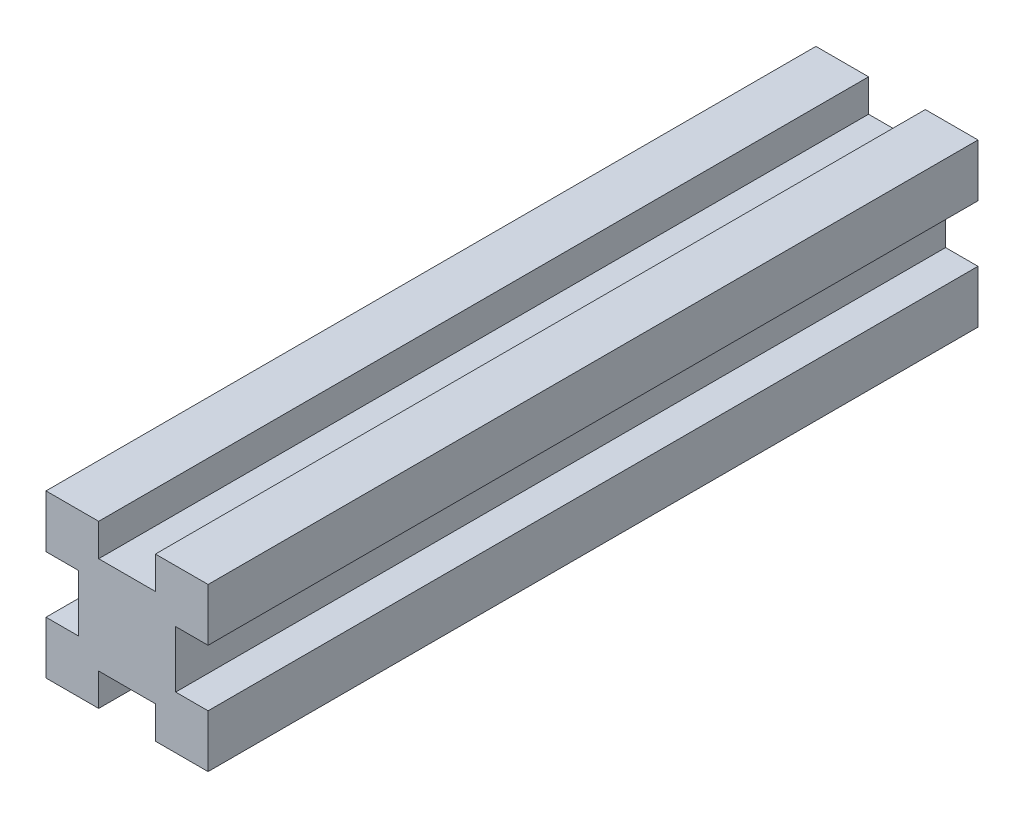
ISO-10303-21;
HEADER;
FILE_DESCRIPTION(('STEP AP214'),'2;1');
FILE_NAME('part.step','',(''),(''),'','','');
FILE_SCHEMA(('AUTOMOTIVE_DESIGN { 1 0 10303 214 1 1 1 1 }'));
ENDSEC;
DATA;
#1=APPLICATION_CONTEXT('core data for automotive mechanical design processes');
#2=APPLICATION_PROTOCOL_DEFINITION('international standard','automotive_design',2000,#1);
#3=PRODUCT_CONTEXT('',#1,'mechanical');
#4=PRODUCT('Part','Part','',(#3));
#5=PRODUCT_RELATED_PRODUCT_CATEGORY('part','',(#4));
#6=PRODUCT_DEFINITION_FORMATION('','',#4);
#7=PRODUCT_DEFINITION_CONTEXT('part definition',#1,'design');
#8=PRODUCT_DEFINITION('design','',#6,#7);
#9=PRODUCT_DEFINITION_SHAPE('','',#8);
#10=(LENGTH_UNIT() NAMED_UNIT(*) SI_UNIT(.MILLI.,.METRE.));
#11=(NAMED_UNIT(*) PLANE_ANGLE_UNIT() SI_UNIT($,.RADIAN.));
#12=(NAMED_UNIT(*) SI_UNIT($,.STERADIAN.) SOLID_ANGLE_UNIT());
#13=UNCERTAINTY_MEASURE_WITH_UNIT(LENGTH_MEASURE(1.E-05),#10,'distance_accuracy_value','');
#14=(GEOMETRIC_REPRESENTATION_CONTEXT(3) GLOBAL_UNCERTAINTY_ASSIGNED_CONTEXT((#13)) GLOBAL_UNIT_ASSIGNED_CONTEXT((#10,
#11,#12)) REPRESENTATION_CONTEXT('',''));
#15=CARTESIAN_POINT('',(0.,0.,0.));
#16=DIRECTION('',(0.,0.,1.));
#17=DIRECTION('',(1.,0.,0.));
#18=AXIS2_PLACEMENT_3D('',#15,#16,#17);
#19=CARTESIAN_POINT('',(0.,0.,0.));
#20=DIRECTION('',(0.,0.,1.));
#21=DIRECTION('',(1.,0.,0.));
#22=AXIS2_PLACEMENT_3D('',#19,#20,#21);
#23=PLANE('',#22);
#24=DIRECTION('',(1.,0.,0.));
#25=VECTOR('',#24,1.);
#26=CARTESIAN_POINT('',(0.,-3.50000000000081,0.));
#27=LINE('',#26,#25);
#28=CARTESIAN_POINT('',(-10.,-3.50000000000081,0.));
#29=VERTEX_POINT('',#28);
#30=CARTESIAN_POINT('',(-5.99999999999979,-3.50000000000081,0.));
#31=VERTEX_POINT('',#30);
#32=EDGE_CURVE('E286',#29,#31,#27,.T.);
#33=ORIENTED_EDGE('',*,*,#32,.T.);
#34=DIRECTION('',(0.,1.,0.));
#35=VECTOR('',#34,1.);
#36=CARTESIAN_POINT('',(-5.99999999999979,0.,0.));
#37=LINE('',#36,#35);
#38=CARTESIAN_POINT('',(-5.99999999999979,3.49999999999919,0.));
#39=VERTEX_POINT('',#38);
#40=EDGE_CURVE('E11',#31,#39,#37,.T.);
#41=ORIENTED_EDGE('',*,*,#40,.T.);
#42=DIRECTION('',(1.,0.,0.));
#43=VECTOR('',#42,1.);
#44=CARTESIAN_POINT('',(0.,3.4999999999992,0.));
#45=LINE('',#44,#43);
#46=CARTESIAN_POINT('',(-10.,3.49999999999919,0.));
#47=VERTEX_POINT('',#46);
#48=EDGE_CURVE('E369',#47,#39,#45,.T.);
#49=ORIENTED_EDGE('',*,*,#48,.F.);
#50=DIRECTION('',(0.,-1.,0.));
#51=VECTOR('',#50,1.);
#52=CARTESIAN_POINT('',(-10.,0.,0.));
#53=LINE('',#52,#51);
#54=CARTESIAN_POINT('',(-10.,10.,0.));
#55=VERTEX_POINT('',#54);
#56=EDGE_CURVE('E205',#55,#47,#53,.T.);
#57=ORIENTED_EDGE('',*,*,#56,.F.);
#58=DIRECTION('',(1.,0.,0.));
#59=VECTOR('',#58,1.);
#60=CARTESIAN_POINT('',(0.,10.,0.));
#61=LINE('',#60,#59);
#62=CARTESIAN_POINT('',(-3.5,10.,0.));
#63=VERTEX_POINT('',#62);
#64=EDGE_CURVE('E206',#55,#63,#61,.T.);
#65=ORIENTED_EDGE('',*,*,#64,.T.);
#66=DIRECTION('',(0.,-1.,0.));
#67=VECTOR('',#66,1.);
#68=CARTESIAN_POINT('',(-3.5,0.,0.));
#69=LINE('',#68,#67);
#70=CARTESIAN_POINT('',(-3.5,6.,0.));
#71=VERTEX_POINT('',#70);
#72=EDGE_CURVE('E169',#63,#71,#69,.T.);
#73=ORIENTED_EDGE('',*,*,#72,.T.);
#74=DIRECTION('',(1.,0.,0.));
#75=VECTOR('',#74,1.);
#76=CARTESIAN_POINT('',(0.,6.,0.));
#77=LINE('',#76,#75);
#78=CARTESIAN_POINT('',(3.5,6.,0.));
#79=VERTEX_POINT('',#78);
#80=EDGE_CURVE('E170',#71,#79,#77,.T.);
#81=ORIENTED_EDGE('',*,*,#80,.T.);
#82=DIRECTION('',(0.,-1.,0.));
#83=VECTOR('',#82,1.);
#84=CARTESIAN_POINT('',(3.5,0.,0.));
#85=LINE('',#84,#83);
#86=CARTESIAN_POINT('',(3.5,10.,0.));
#87=VERTEX_POINT('',#86);
#88=EDGE_CURVE('E233',#87,#79,#85,.T.);
#89=ORIENTED_EDGE('',*,*,#88,.F.);
#90=DIRECTION('',(1.,0.,0.));
#91=VECTOR('',#90,1.);
#92=CARTESIAN_POINT('',(0.,10.,0.));
#93=LINE('',#92,#91);
#94=CARTESIAN_POINT('',(10.,10.,0.));
#95=VERTEX_POINT('',#94);
#96=EDGE_CURVE('E234',#87,#95,#93,.T.);
#97=ORIENTED_EDGE('',*,*,#96,.T.);
#98=DIRECTION('',(0.,-1.,0.));
#99=VECTOR('',#98,1.);
#100=CARTESIAN_POINT('',(10.,0.,0.));
#101=LINE('',#100,#99);
#102=CARTESIAN_POINT('',(10.,3.50000000000021,0.));
#103=VERTEX_POINT('',#102);
#104=EDGE_CURVE('E201',#95,#103,#101,.T.);
#105=ORIENTED_EDGE('',*,*,#104,.T.);
#106=DIRECTION('',(-1.,0.,0.));
#107=VECTOR('',#106,1.);
#108=CARTESIAN_POINT('',(0.,3.50000000000021,0.));
#109=LINE('',#108,#107);
#110=CARTESIAN_POINT('',(6.00000000000081,3.50000000000021,0.));
#111=VERTEX_POINT('',#110);
#112=EDGE_CURVE('E184',#103,#111,#109,.T.);
#113=ORIENTED_EDGE('',*,*,#112,.T.);
#114=DIRECTION('',(0.,-1.,0.));
#115=VECTOR('',#114,1.);
#116=CARTESIAN_POINT('',(6.00000000000081,0.,0.));
#117=LINE('',#116,#115);
#118=CARTESIAN_POINT('',(6.00000000000081,-3.49999999999979,0.));
#119=VERTEX_POINT('',#118);
#120=EDGE_CURVE('E172',#111,#119,#117,.T.);
#121=ORIENTED_EDGE('',*,*,#120,.T.);
#122=DIRECTION('',(-1.,0.,0.));
#123=VECTOR('',#122,1.);
#124=CARTESIAN_POINT('',(0.,-3.4999999999998,0.));
#125=LINE('',#124,#123);
#126=CARTESIAN_POINT('',(10.0000000000008,-3.49999999999979,0.));
#127=VERTEX_POINT('',#126);
#128=EDGE_CURVE('E187',#127,#119,#125,.T.);
#129=ORIENTED_EDGE('',*,*,#128,.F.);
#130=DIRECTION('',(0.,-1.,0.));
#131=VECTOR('',#130,1.);
#132=CARTESIAN_POINT('',(10.,0.,0.));
#133=LINE('',#132,#131);
#134=CARTESIAN_POINT('',(10.,-10.,0.));
#135=VERTEX_POINT('',#134);
#136=EDGE_CURVE('E133',#127,#135,#133,.T.);
#137=ORIENTED_EDGE('',*,*,#136,.T.);
#138=DIRECTION('',(1.,0.,0.));
#139=VECTOR('',#138,1.);
#140=CARTESIAN_POINT('',(0.,-10.,0.));
#141=LINE('',#140,#139);
#142=CARTESIAN_POINT('',(3.50000000000102,-10.,0.));
#143=VERTEX_POINT('',#142);
#144=EDGE_CURVE('E127',#143,#135,#141,.T.);
#145=ORIENTED_EDGE('',*,*,#144,.F.);
#146=DIRECTION('',(0.,1.,0.));
#147=VECTOR('',#146,1.);
#148=CARTESIAN_POINT('',(3.50000000000102,0.,0.));
#149=LINE('',#148,#147);
#150=CARTESIAN_POINT('',(3.50000000000102,-6.00000000000061,0.));
#151=VERTEX_POINT('',#150);
#152=EDGE_CURVE('E130',#143,#151,#149,.T.);
#153=ORIENTED_EDGE('',*,*,#152,.T.);
#154=DIRECTION('',(-1.,0.,0.));
#155=VECTOR('',#154,1.);
#156=CARTESIAN_POINT('',(0.,-6.00000000000061,0.));
#157=LINE('',#156,#155);
#158=CARTESIAN_POINT('',(-3.49999999999898,-6.00000000000061,0.));
#159=VERTEX_POINT('',#158);
#160=EDGE_CURVE('E93',#151,#159,#157,.T.);
#161=ORIENTED_EDGE('',*,*,#160,.T.);
#162=DIRECTION('',(0.,1.,0.));
#163=VECTOR('',#162,1.);
#164=CARTESIAN_POINT('',(-3.49999999999899,0.,0.));
#165=LINE('',#164,#163);
#166=CARTESIAN_POINT('',(-3.49999999999898,-10.,0.));
#167=VERTEX_POINT('',#166);
#168=EDGE_CURVE('E105',#167,#159,#165,.T.);
#169=ORIENTED_EDGE('',*,*,#168,.F.);
#170=DIRECTION('',(1.,0.,0.));
#171=VECTOR('',#170,1.);
#172=CARTESIAN_POINT('',(0.,-10.,0.));
#173=LINE('',#172,#171);
#174=CARTESIAN_POINT('',(-10.,-10.,0.));
#175=VERTEX_POINT('',#174);
#176=EDGE_CURVE('E253',#175,#167,#173,.T.);
#177=ORIENTED_EDGE('',*,*,#176,.F.);
#178=DIRECTION('',(0.,-1.,0.));
#179=VECTOR('',#178,1.);
#180=CARTESIAN_POINT('',(-10.,0.,0.));
#181=LINE('',#180,#179);
#182=EDGE_CURVE('E40',#29,#175,#181,.T.);
#183=ORIENTED_EDGE('',*,*,#182,.F.);
#184=EDGE_LOOP('',(#33,#41,#49,#57,#65,#73,#81,#89,#97,#105,#113,#121,#129,#137,#145,#153,#161,
#169,#177,#183));
#185=FACE_BOUND('',#184,.T.);
#186=ADVANCED_FACE('F36',(#185),#23,.F.);
#187=CARTESIAN_POINT('',(-5.99999999999979,0.,50.));
#188=DIRECTION('',(-1.,0.,0.));
#189=DIRECTION('',(0.,1.,0.));
#190=AXIS2_PLACEMENT_3D('',#187,#188,#189);
#191=PLANE('',#190);
#192=ORIENTED_EDGE('',*,*,#40,.F.);
#193=DIRECTION('',(0.,0.,-1.));
#194=VECTOR('',#193,1.);
#195=CARTESIAN_POINT('',(-5.99999999999979,-3.50000000000081,50.));
#196=LINE('',#195,#194);
#197=CARTESIAN_POINT('',(-5.99999999999979,-3.50000000000081,95.));
#198=VERTEX_POINT('',#197);
#199=EDGE_CURVE('E274',#198,#31,#196,.T.);
#200=ORIENTED_EDGE('',*,*,#199,.F.);
#201=DIRECTION('',(0.,-1.,0.));
#202=VECTOR('',#201,1.);
#203=CARTESIAN_POINT('',(-5.99999999999979,-3.50000000000081,95.));
#204=LINE('',#203,#202);
#205=CARTESIAN_POINT('',(-5.99999999999979,3.49999999999919,95.));
#206=VERTEX_POINT('',#205);
#207=EDGE_CURVE('E390',#206,#198,#204,.T.);
#208=ORIENTED_EDGE('',*,*,#207,.F.);
#209=DIRECTION('',(0.,0.,-1.));
#210=VECTOR('',#209,1.);
#211=CARTESIAN_POINT('',(-5.99999999999979,3.49999999999919,50.));
#212=LINE('',#211,#210);
#213=EDGE_CURVE('E47',#206,#39,#212,.T.);
#214=ORIENTED_EDGE('',*,*,#213,.T.);
#215=EDGE_LOOP('',(#192,#200,#208,#214));
#216=FACE_BOUND('',#215,.T.);
#217=ADVANCED_FACE('F326',(#216),#191,.T.);
#218=CARTESIAN_POINT('',(0.,3.4999999999992,50.));
#219=DIRECTION('',(0.,1.,0.));
#220=DIRECTION('',(1.,0.,0.));
#221=AXIS2_PLACEMENT_3D('',#218,#219,#220);
#222=PLANE('',#221);
#223=ORIENTED_EDGE('',*,*,#48,.T.);
#224=ORIENTED_EDGE('',*,*,#213,.F.);
#225=DIRECTION('',(1.,0.,0.));
#226=VECTOR('',#225,1.);
#227=CARTESIAN_POINT('',(-10.,3.49999999999919,95.));
#228=LINE('',#227,#226);
#229=CARTESIAN_POINT('',(-10.,3.49999999999919,95.));
#230=VERTEX_POINT('',#229);
#231=EDGE_CURVE('E380',#230,#206,#228,.T.);
#232=ORIENTED_EDGE('',*,*,#231,.F.);
#233=DIRECTION('',(0.,0.,-1.));
#234=VECTOR('',#233,1.);
#235=CARTESIAN_POINT('',(-10.,3.49999999999919,50.));
#236=LINE('',#235,#234);
#237=EDGE_CURVE('E210',#230,#47,#236,.T.);
#238=ORIENTED_EDGE('',*,*,#237,.T.);
#239=EDGE_LOOP('',(#223,#224,#232,#238));
#240=FACE_BOUND('',#239,.T.);
#241=ADVANCED_FACE('F331',(#240),#222,.F.);
#242=CARTESIAN_POINT('',(-10.,0.,50.));
#243=DIRECTION('',(1.,0.,0.));
#244=DIRECTION('',(0.,1.,0.));
#245=AXIS2_PLACEMENT_3D('',#242,#243,#244);
#246=PLANE('',#245);
#247=ORIENTED_EDGE('',*,*,#56,.T.);
#248=ORIENTED_EDGE('',*,*,#237,.F.);
#249=DIRECTION('',(0.,-1.,0.));
#250=VECTOR('',#249,1.);
#251=CARTESIAN_POINT('',(-10.,10.,95.));
#252=LINE('',#251,#250);
#253=CARTESIAN_POINT('',(-10.,10.,95.));
#254=VERTEX_POINT('',#253);
#255=EDGE_CURVE('E373',#254,#230,#252,.T.);
#256=ORIENTED_EDGE('',*,*,#255,.F.);
#257=DIRECTION('',(0.,0.,-1.));
#258=VECTOR('',#257,1.);
#259=CARTESIAN_POINT('',(-10.,10.,50.));
#260=LINE('',#259,#258);
#261=EDGE_CURVE('E202',#254,#55,#260,.T.);
#262=ORIENTED_EDGE('',*,*,#261,.T.);
#263=EDGE_LOOP('',(#247,#248,#256,#262));
#264=FACE_BOUND('',#263,.T.);
#265=ADVANCED_FACE('F350',(#264),#246,.F.);
#266=CARTESIAN_POINT('',(0.,10.,50.));
#267=DIRECTION('',(0.,1.,0.));
#268=DIRECTION('',(1.,0.,0.));
#269=AXIS2_PLACEMENT_3D('',#266,#267,#268);
#270=PLANE('',#269);
#271=ORIENTED_EDGE('',*,*,#64,.F.);
#272=ORIENTED_EDGE('',*,*,#261,.F.);
#273=DIRECTION('',(-1.,0.,0.));
#274=VECTOR('',#273,1.);
#275=CARTESIAN_POINT('',(-10.,10.,95.));
#276=LINE('',#275,#274);
#277=CARTESIAN_POINT('',(-3.5,10.,95.));
#278=VERTEX_POINT('',#277);
#279=EDGE_CURVE('E381',#278,#254,#276,.T.);
#280=ORIENTED_EDGE('',*,*,#279,.F.);
#281=DIRECTION('',(0.,0.,-1.));
#282=VECTOR('',#281,1.);
#283=CARTESIAN_POINT('',(-3.5,10.,50.));
#284=LINE('',#283,#282);
#285=EDGE_CURVE('E215',#278,#63,#284,.T.);
#286=ORIENTED_EDGE('',*,*,#285,.T.);
#287=EDGE_LOOP('',(#271,#272,#280,#286));
#288=FACE_BOUND('',#287,.T.);
#289=ADVANCED_FACE('F347',(#288),#270,.T.);
#290=CARTESIAN_POINT('',(-3.5,0.,50.));
#291=DIRECTION('',(1.,0.,0.));
#292=DIRECTION('',(0.,-1.,0.));
#293=AXIS2_PLACEMENT_3D('',#290,#291,#292);
#294=PLANE('',#293);
#295=ORIENTED_EDGE('',*,*,#72,.F.);
#296=ORIENTED_EDGE('',*,*,#285,.F.);
#297=DIRECTION('',(0.,1.,0.));
#298=VECTOR('',#297,1.);
#299=CARTESIAN_POINT('',(-3.5,10.,95.));
#300=LINE('',#299,#298);
#301=CARTESIAN_POINT('',(-3.5,6.,95.));
#302=VERTEX_POINT('',#301);
#303=EDGE_CURVE('E295',#302,#278,#300,.T.);
#304=ORIENTED_EDGE('',*,*,#303,.F.);
#305=DIRECTION('',(0.,0.,-1.));
#306=VECTOR('',#305,1.);
#307=CARTESIAN_POINT('',(-3.5,6.,50.));
#308=LINE('',#307,#306);
#309=EDGE_CURVE('E166',#302,#71,#308,.T.);
#310=ORIENTED_EDGE('',*,*,#309,.T.);
#311=EDGE_LOOP('',(#295,#296,#304,#310));
#312=FACE_BOUND('',#311,.T.);
#313=ADVANCED_FACE('F349',(#312),#294,.T.);
#314=CARTESIAN_POINT('',(0.,6.,50.));
#315=DIRECTION('',(0.,1.,0.));
#316=DIRECTION('',(1.,0.,0.));
#317=AXIS2_PLACEMENT_3D('',#314,#315,#316);
#318=PLANE('',#317);
#319=ORIENTED_EDGE('',*,*,#80,.F.);
#320=ORIENTED_EDGE('',*,*,#309,.F.);
#321=DIRECTION('',(-1.,0.,0.));
#322=VECTOR('',#321,1.);
#323=CARTESIAN_POINT('',(-3.5,6.,95.));
#324=LINE('',#323,#322);
#325=CARTESIAN_POINT('',(3.5,6.,95.));
#326=VERTEX_POINT('',#325);
#327=EDGE_CURVE('E429',#326,#302,#324,.T.);
#328=ORIENTED_EDGE('',*,*,#327,.F.);
#329=DIRECTION('',(0.,0.,-1.));
#330=VECTOR('',#329,1.);
#331=CARTESIAN_POINT('',(3.5,6.,50.));
#332=LINE('',#331,#330);
#333=EDGE_CURVE('E244',#326,#79,#332,.T.);
#334=ORIENTED_EDGE('',*,*,#333,.T.);
#335=EDGE_LOOP('',(#319,#320,#328,#334));
#336=FACE_BOUND('',#335,.T.);
#337=ADVANCED_FACE('F356',(#336),#318,.T.);
#338=CARTESIAN_POINT('',(3.5,0.,50.));
#339=DIRECTION('',(1.,0.,0.));
#340=DIRECTION('',(0.,1.,0.));
#341=AXIS2_PLACEMENT_3D('',#338,#339,#340);
#342=PLANE('',#341);
#343=ORIENTED_EDGE('',*,*,#88,.T.);
#344=ORIENTED_EDGE('',*,*,#333,.F.);
#345=DIRECTION('',(0.,-1.,0.));
#346=VECTOR('',#345,1.);
#347=CARTESIAN_POINT('',(3.5,10.,95.));
#348=LINE('',#347,#346);
#349=CARTESIAN_POINT('',(3.5,10.,95.));
#350=VERTEX_POINT('',#349);
#351=EDGE_CURVE('E426',#350,#326,#348,.T.);
#352=ORIENTED_EDGE('',*,*,#351,.F.);
#353=DIRECTION('',(0.,0.,-1.));
#354=VECTOR('',#353,1.);
#355=CARTESIAN_POINT('',(3.5,10.,50.));
#356=LINE('',#355,#354);
#357=EDGE_CURVE('E229',#350,#87,#356,.T.);
#358=ORIENTED_EDGE('',*,*,#357,.T.);
#359=EDGE_LOOP('',(#343,#344,#352,#358));
#360=FACE_BOUND('',#359,.T.);
#361=ADVANCED_FACE('F322',(#360),#342,.F.);
#362=CARTESIAN_POINT('',(0.,10.,50.));
#363=DIRECTION('',(0.,1.,0.));
#364=DIRECTION('',(1.,0.,0.));
#365=AXIS2_PLACEMENT_3D('',#362,#363,#364);
#366=PLANE('',#365);
#367=ORIENTED_EDGE('',*,*,#96,.F.);
#368=ORIENTED_EDGE('',*,*,#357,.F.);
#369=DIRECTION('',(-1.,0.,0.));
#370=VECTOR('',#369,1.);
#371=CARTESIAN_POINT('',(3.5,10.,95.));
#372=LINE('',#371,#370);
#373=CARTESIAN_POINT('',(10.,10.,95.));
#374=VERTEX_POINT('',#373);
#375=EDGE_CURVE('E309',#374,#350,#372,.T.);
#376=ORIENTED_EDGE('',*,*,#375,.F.);
#377=DIRECTION('',(0.,0.,-1.));
#378=VECTOR('',#377,1.);
#379=CARTESIAN_POINT('',(10.,10.,50.));
#380=LINE('',#379,#378);
#381=EDGE_CURVE('E164',#374,#95,#380,.T.);
#382=ORIENTED_EDGE('',*,*,#381,.T.);
#383=EDGE_LOOP('',(#367,#368,#376,#382));
#384=FACE_BOUND('',#383,.T.);
#385=ADVANCED_FACE('F38',(#384),#366,.T.);
#386=CARTESIAN_POINT('',(10.,0.,50.));
#387=DIRECTION('',(1.,0.,0.));
#388=DIRECTION('',(0.,1.,0.));
#389=AXIS2_PLACEMENT_3D('',#386,#387,#388);
#390=PLANE('',#389);
#391=ORIENTED_EDGE('',*,*,#104,.F.);
#392=ORIENTED_EDGE('',*,*,#381,.F.);
#393=DIRECTION('',(0.,1.,0.));
#394=VECTOR('',#393,1.);
#395=CARTESIAN_POINT('',(10.,10.,95.));
#396=LINE('',#395,#394);
#397=CARTESIAN_POINT('',(10.,3.50000000000021,95.));
#398=VERTEX_POINT('',#397);
#399=EDGE_CURVE('E423',#398,#374,#396,.T.);
#400=ORIENTED_EDGE('',*,*,#399,.F.);
#401=DIRECTION('',(0.,0.,-1.));
#402=VECTOR('',#401,1.);
#403=CARTESIAN_POINT('',(10.,3.50000000000021,50.));
#404=LINE('',#403,#402);
#405=EDGE_CURVE('E213',#398,#103,#404,.T.);
#406=ORIENTED_EDGE('',*,*,#405,.T.);
#407=EDGE_LOOP('',(#391,#392,#400,#406));
#408=FACE_BOUND('',#407,.T.);
#409=ADVANCED_FACE('F311',(#408),#390,.T.);
#410=CARTESIAN_POINT('',(0.,3.50000000000021,50.));
#411=DIRECTION('',(0.,-1.,0.));
#412=DIRECTION('',(0.,0.,-1.));
#413=AXIS2_PLACEMENT_3D('',#410,#411,#412);
#414=PLANE('',#413);
#415=ORIENTED_EDGE('',*,*,#112,.F.);
#416=ORIENTED_EDGE('',*,*,#405,.F.);
#417=DIRECTION('',(1.,0.,0.));
#418=VECTOR('',#417,1.);
#419=CARTESIAN_POINT('',(10.,3.50000000000021,95.));
#420=LINE('',#419,#418);
#421=CARTESIAN_POINT('',(6.00000000000081,3.50000000000021,95.));
#422=VERTEX_POINT('',#421);
#423=EDGE_CURVE('E420',#422,#398,#420,.T.);
#424=ORIENTED_EDGE('',*,*,#423,.F.);
#425=DIRECTION('',(0.,0.,-1.));
#426=VECTOR('',#425,1.);
#427=CARTESIAN_POINT('',(6.00000000000081,3.50000000000021,50.));
#428=LINE('',#427,#426);
#429=EDGE_CURVE('E175',#422,#111,#428,.T.);
#430=ORIENTED_EDGE('',*,*,#429,.T.);
#431=EDGE_LOOP('',(#415,#416,#424,#430));
#432=FACE_BOUND('',#431,.T.);
#433=ADVANCED_FACE('F313',(#432),#414,.T.);
#434=CARTESIAN_POINT('',(6.00000000000081,0.,50.));
#435=DIRECTION('',(1.,0.,0.));
#436=DIRECTION('',(0.,-1.,0.));
#437=AXIS2_PLACEMENT_3D('',#434,#435,#436);
#438=PLANE('',#437);
#439=ORIENTED_EDGE('',*,*,#120,.F.);
#440=ORIENTED_EDGE('',*,*,#429,.F.);
#441=DIRECTION('',(0.,1.,0.));
#442=VECTOR('',#441,1.);
#443=CARTESIAN_POINT('',(6.00000000000081,3.50000000000021,95.));
#444=LINE('',#443,#442);
#445=CARTESIAN_POINT('',(6.00000000000081,-3.49999999999979,95.));
#446=VERTEX_POINT('',#445);
#447=EDGE_CURVE('E417',#446,#422,#444,.T.);
#448=ORIENTED_EDGE('',*,*,#447,.F.);
#449=DIRECTION('',(0.,0.,-1.));
#450=VECTOR('',#449,1.);
#451=CARTESIAN_POINT('',(6.00000000000081,-3.49999999999979,50.));
#452=LINE('',#451,#450);
#453=EDGE_CURVE('E176',#446,#119,#452,.T.);
#454=ORIENTED_EDGE('',*,*,#453,.T.);
#455=EDGE_LOOP('',(#439,#440,#448,#454));
#456=FACE_BOUND('',#455,.T.);
#457=ADVANCED_FACE('F319',(#456),#438,.T.);
#458=CARTESIAN_POINT('',(0.,-3.4999999999998,50.));
#459=DIRECTION('',(0.,-1.,0.));
#460=DIRECTION('',(0.,0.,-1.));
#461=AXIS2_PLACEMENT_3D('',#458,#459,#460);
#462=PLANE('',#461);
#463=ORIENTED_EDGE('',*,*,#128,.T.);
#464=ORIENTED_EDGE('',*,*,#453,.F.);
#465=DIRECTION('',(-1.,0.,0.));
#466=VECTOR('',#465,1.);
#467=CARTESIAN_POINT('',(10.0000000000008,-3.49999999999979,95.));
#468=LINE('',#467,#466);
#469=CARTESIAN_POINT('',(10.0000000000008,-3.49999999999979,95.));
#470=VERTEX_POINT('',#469);
#471=EDGE_CURVE('E414',#470,#446,#468,.T.);
#472=ORIENTED_EDGE('',*,*,#471,.F.);
#473=DIRECTION('',(0.,0.,-1.));
#474=VECTOR('',#473,1.);
#475=CARTESIAN_POINT('',(10.0000000000008,-3.49999999999979,50.));
#476=LINE('',#475,#474);
#477=EDGE_CURVE('E197',#470,#127,#476,.T.);
#478=ORIENTED_EDGE('',*,*,#477,.T.);
#479=EDGE_LOOP('',(#463,#464,#472,#478));
#480=FACE_BOUND('',#479,.T.);
#481=ADVANCED_FACE('F471',(#480),#462,.F.);
#482=CARTESIAN_POINT('',(10.,0.,50.));
#483=DIRECTION('',(1.,0.,0.));
#484=DIRECTION('',(0.,1.,0.));
#485=AXIS2_PLACEMENT_3D('',#482,#483,#484);
#486=PLANE('',#485);
#487=ORIENTED_EDGE('',*,*,#136,.F.);
#488=ORIENTED_EDGE('',*,*,#477,.F.);
#489=DIRECTION('',(1.23031926526966E-13,1.,0.));
#490=VECTOR('',#489,1.);
#491=CARTESIAN_POINT('',(10.0000000000008,-3.49999999999979,95.));
#492=LINE('',#491,#490);
#493=CARTESIAN_POINT('',(10.,-10.,95.));
#494=VERTEX_POINT('',#493);
#495=EDGE_CURVE('E411',#494,#470,#492,.T.);
#496=ORIENTED_EDGE('',*,*,#495,.F.);
#497=DIRECTION('',(0.,0.,-1.));
#498=VECTOR('',#497,1.);
#499=CARTESIAN_POINT('',(10.,-10.,50.));
#500=LINE('',#499,#498);
#501=EDGE_CURVE('E138',#494,#135,#500,.T.);
#502=ORIENTED_EDGE('',*,*,#501,.T.);
#503=EDGE_LOOP('',(#487,#488,#496,#502));
#504=FACE_BOUND('',#503,.T.);
#505=ADVANCED_FACE('F476',(#504),#486,.T.);
#506=CARTESIAN_POINT('',(0.,-10.,50.));
#507=DIRECTION('',(0.,1.,0.));
#508=DIRECTION('',(1.,0.,0.));
#509=AXIS2_PLACEMENT_3D('',#506,#507,#508);
#510=PLANE('',#509);
#511=ORIENTED_EDGE('',*,*,#144,.T.);
#512=ORIENTED_EDGE('',*,*,#501,.F.);
#513=DIRECTION('',(1.,0.,0.));
#514=VECTOR('',#513,1.);
#515=CARTESIAN_POINT('',(3.50000000000102,-10.,95.));
#516=LINE('',#515,#514);
#517=CARTESIAN_POINT('',(3.50000000000102,-10.,95.));
#518=VERTEX_POINT('',#517);
#519=EDGE_CURVE('E146',#518,#494,#516,.T.);
#520=ORIENTED_EDGE('',*,*,#519,.F.);
#521=DIRECTION('',(0.,0.,-1.));
#522=VECTOR('',#521,1.);
#523=CARTESIAN_POINT('',(3.50000000000102,-10.,50.));
#524=LINE('',#523,#522);
#525=EDGE_CURVE('E139',#518,#143,#524,.T.);
#526=ORIENTED_EDGE('',*,*,#525,.T.);
#527=EDGE_LOOP('',(#511,#512,#520,#526));
#528=FACE_BOUND('',#527,.T.);
#529=ADVANCED_FACE('F143',(#528),#510,.F.);
#530=CARTESIAN_POINT('',(3.50000000000102,0.,50.));
#531=DIRECTION('',(-1.,0.,0.));
#532=DIRECTION('',(0.,1.,0.));
#533=AXIS2_PLACEMENT_3D('',#530,#531,#532);
#534=PLANE('',#533);
#535=ORIENTED_EDGE('',*,*,#152,.F.);
#536=ORIENTED_EDGE('',*,*,#525,.F.);
#537=DIRECTION('',(0.,-1.,0.));
#538=VECTOR('',#537,1.);
#539=CARTESIAN_POINT('',(3.50000000000102,-10.,95.));
#540=LINE('',#539,#538);
#541=CARTESIAN_POINT('',(3.50000000000102,-6.00000000000061,95.));
#542=VERTEX_POINT('',#541);
#543=EDGE_CURVE('E408',#542,#518,#540,.T.);
#544=ORIENTED_EDGE('',*,*,#543,.F.);
#545=DIRECTION('',(0.,0.,-1.));
#546=VECTOR('',#545,1.);
#547=CARTESIAN_POINT('',(3.50000000000102,-6.00000000000061,50.));
#548=LINE('',#547,#546);
#549=EDGE_CURVE('E154',#542,#151,#548,.T.);
#550=ORIENTED_EDGE('',*,*,#549,.T.);
#551=EDGE_LOOP('',(#535,#536,#544,#550));
#552=FACE_BOUND('',#551,.T.);
#553=ADVANCED_FACE('F152',(#552),#534,.T.);
#554=CARTESIAN_POINT('',(0.,-6.00000000000061,50.));
#555=DIRECTION('',(0.,-1.,0.));
#556=DIRECTION('',(-1.,0.,0.));
#557=AXIS2_PLACEMENT_3D('',#554,#555,#556);
#558=PLANE('',#557);
#559=ORIENTED_EDGE('',*,*,#160,.F.);
#560=ORIENTED_EDGE('',*,*,#549,.F.);
#561=DIRECTION('',(1.,0.,0.));
#562=VECTOR('',#561,1.);
#563=CARTESIAN_POINT('',(3.50000000000102,-6.00000000000061,95.));
#564=LINE('',#563,#562);
#565=CARTESIAN_POINT('',(-3.49999999999898,-6.00000000000061,95.));
#566=VERTEX_POINT('',#565);
#567=EDGE_CURVE('E405',#566,#542,#564,.T.);
#568=ORIENTED_EDGE('',*,*,#567,.F.);
#569=DIRECTION('',(0.,0.,-1.));
#570=VECTOR('',#569,1.);
#571=CARTESIAN_POINT('',(-3.49999999999898,-6.00000000000061,50.));
#572=LINE('',#571,#570);
#573=EDGE_CURVE('E238',#566,#159,#572,.T.);
#574=ORIENTED_EDGE('',*,*,#573,.T.);
#575=EDGE_LOOP('',(#559,#560,#568,#574));
#576=FACE_BOUND('',#575,.T.);
#577=ADVANCED_FACE('F481',(#576),#558,.T.);
#578=CARTESIAN_POINT('',(-3.49999999999899,0.,50.));
#579=DIRECTION('',(-1.,0.,0.));
#580=DIRECTION('',(0.,1.,0.));
#581=AXIS2_PLACEMENT_3D('',#578,#579,#580);
#582=PLANE('',#581);
#583=ORIENTED_EDGE('',*,*,#168,.T.);
#584=ORIENTED_EDGE('',*,*,#573,.F.);
#585=DIRECTION('',(0.,1.,0.));
#586=VECTOR('',#585,1.);
#587=CARTESIAN_POINT('',(-3.49999999999898,-10.,95.));
#588=LINE('',#587,#586);
#589=CARTESIAN_POINT('',(-3.49999999999898,-10.,95.));
#590=VERTEX_POINT('',#589);
#591=EDGE_CURVE('E402',#590,#566,#588,.T.);
#592=ORIENTED_EDGE('',*,*,#591,.F.);
#593=DIRECTION('',(0.,0.,-1.));
#594=VECTOR('',#593,1.);
#595=CARTESIAN_POINT('',(-3.49999999999898,-10.,50.));
#596=LINE('',#595,#594);
#597=EDGE_CURVE('E250',#590,#167,#596,.T.);
#598=ORIENTED_EDGE('',*,*,#597,.T.);
#599=EDGE_LOOP('',(#583,#584,#592,#598));
#600=FACE_BOUND('',#599,.T.);
#601=ADVANCED_FACE('F345',(#600),#582,.F.);
#602=CARTESIAN_POINT('',(0.,-10.,50.));
#603=DIRECTION('',(0.,1.,0.));
#604=DIRECTION('',(1.,0.,0.));
#605=AXIS2_PLACEMENT_3D('',#602,#603,#604);
#606=PLANE('',#605);
#607=ORIENTED_EDGE('',*,*,#176,.T.);
#608=ORIENTED_EDGE('',*,*,#597,.F.);
#609=DIRECTION('',(1.,0.,0.));
#610=VECTOR('',#609,1.);
#611=CARTESIAN_POINT('',(-10.,-10.,95.));
#612=LINE('',#611,#610);
#613=CARTESIAN_POINT('',(-10.,-10.,95.));
#614=VERTEX_POINT('',#613);
#615=EDGE_CURVE('E399',#614,#590,#612,.T.);
#616=ORIENTED_EDGE('',*,*,#615,.F.);
#617=DIRECTION('',(0.,0.,-1.));
#618=VECTOR('',#617,1.);
#619=CARTESIAN_POINT('',(-10.,-10.,50.));
#620=LINE('',#619,#618);
#621=EDGE_CURVE('E272',#614,#175,#620,.T.);
#622=ORIENTED_EDGE('',*,*,#621,.T.);
#623=EDGE_LOOP('',(#607,#608,#616,#622));
#624=FACE_BOUND('',#623,.T.);
#625=ADVANCED_FACE('F340',(#624),#606,.F.);
#626=CARTESIAN_POINT('',(-10.,0.,50.));
#627=DIRECTION('',(1.,0.,0.));
#628=DIRECTION('',(0.,1.,0.));
#629=AXIS2_PLACEMENT_3D('',#626,#627,#628);
#630=PLANE('',#629);
#631=ORIENTED_EDGE('',*,*,#182,.T.);
#632=ORIENTED_EDGE('',*,*,#621,.F.);
#633=DIRECTION('',(0.,-1.,0.));
#634=VECTOR('',#633,1.);
#635=CARTESIAN_POINT('',(-10.,-3.50000000000081,95.));
#636=LINE('',#635,#634);
#637=CARTESIAN_POINT('',(-10.,-3.50000000000081,95.));
#638=VERTEX_POINT('',#637);
#639=EDGE_CURVE('E396',#638,#614,#636,.T.);
#640=ORIENTED_EDGE('',*,*,#639,.F.);
#641=DIRECTION('',(0.,0.,-1.));
#642=VECTOR('',#641,1.);
#643=CARTESIAN_POINT('',(-10.,-3.50000000000081,50.));
#644=LINE('',#643,#642);
#645=EDGE_CURVE('E277',#638,#29,#644,.T.);
#646=ORIENTED_EDGE('',*,*,#645,.T.);
#647=EDGE_LOOP('',(#631,#632,#640,#646));
#648=FACE_BOUND('',#647,.T.);
#649=ADVANCED_FACE('F336',(#648),#630,.F.);
#650=CARTESIAN_POINT('',(0.,-3.50000000000081,50.));
#651=DIRECTION('',(0.,1.,0.));
#652=DIRECTION('',(1.,0.,0.));
#653=AXIS2_PLACEMENT_3D('',#650,#651,#652);
#654=PLANE('',#653);
#655=ORIENTED_EDGE('',*,*,#32,.F.);
#656=ORIENTED_EDGE('',*,*,#645,.F.);
#657=DIRECTION('',(-1.,0.,0.));
#658=VECTOR('',#657,1.);
#659=CARTESIAN_POINT('',(-10.,-3.50000000000081,95.));
#660=LINE('',#659,#658);
#661=EDGE_CURVE('E393',#198,#638,#660,.T.);
#662=ORIENTED_EDGE('',*,*,#661,.F.);
#663=ORIENTED_EDGE('',*,*,#199,.T.);
#664=EDGE_LOOP('',(#655,#656,#662,#663));
#665=FACE_BOUND('',#664,.T.);
#666=ADVANCED_FACE('F339',(#665),#654,.T.);
#667=CARTESIAN_POINT('',(0.,0.,95.));
#668=DIRECTION('',(0.,0.,-1.));
#669=DIRECTION('',(-1.,0.,0.));
#670=AXIS2_PLACEMENT_3D('',#667,#668,#669);
#671=PLANE('',#670);
#672=ORIENTED_EDGE('',*,*,#279,.T.);
#673=ORIENTED_EDGE('',*,*,#255,.T.);
#674=ORIENTED_EDGE('',*,*,#231,.T.);
#675=ORIENTED_EDGE('',*,*,#207,.T.);
#676=ORIENTED_EDGE('',*,*,#661,.T.);
#677=ORIENTED_EDGE('',*,*,#639,.T.);
#678=ORIENTED_EDGE('',*,*,#615,.T.);
#679=ORIENTED_EDGE('',*,*,#591,.T.);
#680=ORIENTED_EDGE('',*,*,#567,.T.);
#681=ORIENTED_EDGE('',*,*,#543,.T.);
#682=ORIENTED_EDGE('',*,*,#519,.T.);
#683=ORIENTED_EDGE('',*,*,#495,.T.);
#684=ORIENTED_EDGE('',*,*,#471,.T.);
#685=ORIENTED_EDGE('',*,*,#447,.T.);
#686=ORIENTED_EDGE('',*,*,#423,.T.);
#687=ORIENTED_EDGE('',*,*,#399,.T.);
#688=ORIENTED_EDGE('',*,*,#375,.T.);
#689=ORIENTED_EDGE('',*,*,#351,.T.);
#690=ORIENTED_EDGE('',*,*,#327,.T.);
#691=ORIENTED_EDGE('',*,*,#303,.T.);
#692=EDGE_LOOP('',(#672,#673,#674,#675,#676,#677,#678,#679,#680,#681,#682,#683,#684,#685,#686,
#687,#688,#689,#690,#691));
#693=FACE_BOUND('',#692,.T.);
#694=ADVANCED_FACE('F343',(#693),#671,.F.);
#695=CLOSED_SHELL('',(#186,#217,#241,#265,#289,#313,#337,#361,#385,#409,#433,#457,#481,#505,
#529,#553,#577,#601,#625,#649,#666,#694));
#696=MANIFOLD_SOLID_BREP('B2',#695);
#697=ADVANCED_BREP_SHAPE_REPRESENTATION('',(#18,#696),#14);
#698=SHAPE_DEFINITION_REPRESENTATION(#9,#697);
ENDSEC;
END-ISO-10303-21;
